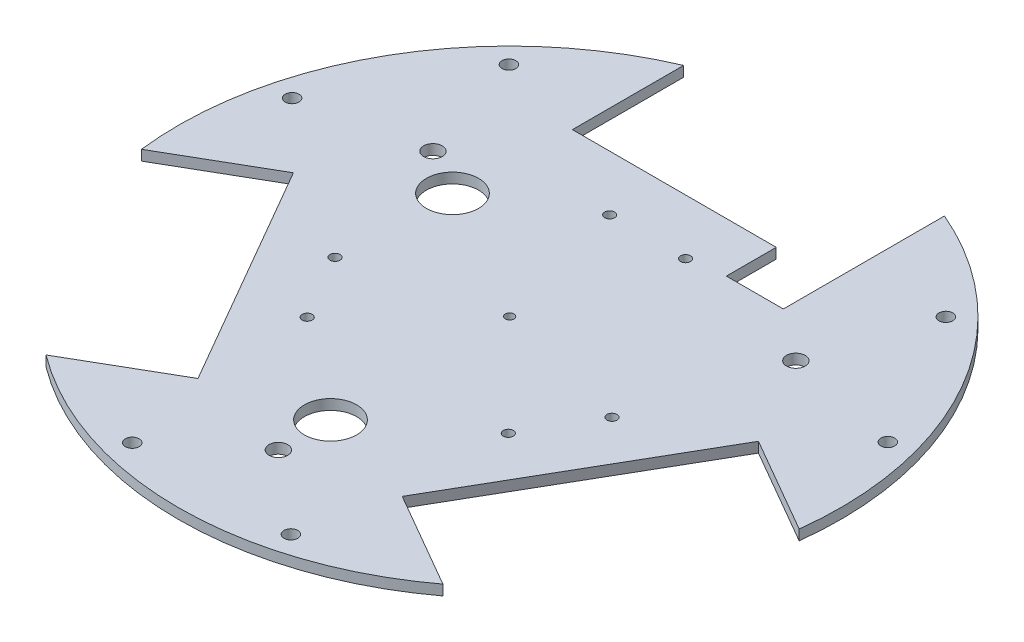
ISO-10303-21;
HEADER;
FILE_DESCRIPTION(('STEP AP214'),'2;1');
FILE_NAME('part.step','',(''),(''),'','','');
FILE_SCHEMA(('AUTOMOTIVE_DESIGN { 1 0 10303 214 1 1 1 1 }'));
ENDSEC;
DATA;
#1=APPLICATION_CONTEXT('core data for automotive mechanical design processes');
#2=APPLICATION_PROTOCOL_DEFINITION('international standard','automotive_design',2000,#1);
#3=PRODUCT_CONTEXT('',#1,'mechanical');
#4=PRODUCT('Part','Part','',(#3));
#5=PRODUCT_RELATED_PRODUCT_CATEGORY('part','',(#4));
#6=PRODUCT_DEFINITION_FORMATION('','',#4);
#7=PRODUCT_DEFINITION_CONTEXT('part definition',#1,'design');
#8=PRODUCT_DEFINITION('design','',#6,#7);
#9=PRODUCT_DEFINITION_SHAPE('','',#8);
#10=(LENGTH_UNIT() NAMED_UNIT(*) SI_UNIT(.MILLI.,.METRE.));
#11=(NAMED_UNIT(*) PLANE_ANGLE_UNIT() SI_UNIT($,.RADIAN.));
#12=(NAMED_UNIT(*) SI_UNIT($,.STERADIAN.) SOLID_ANGLE_UNIT());
#13=UNCERTAINTY_MEASURE_WITH_UNIT(LENGTH_MEASURE(1.E-05),#10,'distance_accuracy_value','');
#14=(GEOMETRIC_REPRESENTATION_CONTEXT(3) GLOBAL_UNCERTAINTY_ASSIGNED_CONTEXT((#13)) GLOBAL_UNIT_ASSIGNED_CONTEXT((#10,
#11,#12)) REPRESENTATION_CONTEXT('',''));
#15=CARTESIAN_POINT('',(0.,0.,0.));
#16=DIRECTION('',(0.,0.,1.));
#17=DIRECTION('',(1.,0.,0.));
#18=AXIS2_PLACEMENT_3D('',#15,#16,#17);
#19=CARTESIAN_POINT('',(0.,2.3622,0.));
#20=DIRECTION('',(0.,1.,0.));
#21=DIRECTION('',(0.,0.,1.));
#22=AXIS2_PLACEMENT_3D('',#19,#20,#21);
#23=PLANE('',#22);
#24=DIRECTION('',(0.,0.,1.));
#25=VECTOR('',#24,1.);
#26=CARTESIAN_POINT('',(29.9999999999978,2.3622,-44.4499999999999));
#27=LINE('',#26,#25);
#28=CARTESIAN_POINT('',(29.999999999998,2.3622,-70.0459848956393));
#29=VERTEX_POINT('',#28);
#30=CARTESIAN_POINT('',(29.9999999999978,2.3622,-32.9726968719721));
#31=VERTEX_POINT('',#30);
#32=EDGE_CURVE('E267',#29,#31,#27,.T.);
#33=ORIENTED_EDGE('',*,*,#32,.T.);
#34=DIRECTION('',(1.,0.,0.));
#35=VECTOR('',#34,1.);
#36=CARTESIAN_POINT('',(29.9999999999978,2.3622,-32.9726968719721));
#37=LINE('',#36,#35);
#38=CARTESIAN_POINT('',(16.8935367171605,2.3622,-32.9726968719721));
#39=VERTEX_POINT('',#38);
#40=EDGE_CURVE('E355',#39,#31,#37,.T.);
#41=ORIENTED_EDGE('',*,*,#40,.F.);
#42=DIRECTION('',(0.,0.,1.));
#43=VECTOR('',#42,1.);
#44=CARTESIAN_POINT('',(16.8935367171605,2.3622,-44.4499999999999));
#45=LINE('',#44,#43);
#46=CARTESIAN_POINT('',(16.8935367171605,2.3622,-44.4499999999999));
#47=VERTEX_POINT('',#46);
#48=EDGE_CURVE('E360',#47,#39,#45,.T.);
#49=ORIENTED_EDGE('',*,*,#48,.F.);
#50=DIRECTION('',(-1.,0.,0.));
#51=VECTOR('',#50,1.);
#52=CARTESIAN_POINT('',(-29.9999999999948,2.3622,-44.45));
#53=LINE('',#52,#51);
#54=CARTESIAN_POINT('',(-29.9999999999948,2.3622,-44.45));
#55=VERTEX_POINT('',#54);
#56=EDGE_CURVE('E248',#47,#55,#53,.T.);
#57=ORIENTED_EDGE('',*,*,#56,.T.);
#58=DIRECTION('',(0.,0.,-1.));
#59=VECTOR('',#58,1.);
#60=CARTESIAN_POINT('',(-29.9999999999948,2.3622,-44.45));
#61=LINE('',#60,#59);
#62=CARTESIAN_POINT('',(-29.9999999999947,2.3622,-70.0459848956406));
#63=VERTEX_POINT('',#62);
#64=EDGE_CURVE('E263',#55,#63,#61,.T.);
#65=ORIENTED_EDGE('',*,*,#64,.T.);
#66=CARTESIAN_POINT('',(0.,2.3622,0.));
#67=DIRECTION('',(0.,1.,0.));
#68=DIRECTION('',(0.,0.,1.));
#69=AXIS2_PLACEMENT_3D('',#66,#67,#68);
#70=CIRCLE('',#69,76.2);
#71=CARTESIAN_POINT('',(-75.6616023527236,2.3622,9.04223033428858));
#72=VERTEX_POINT('',#71);
#73=EDGE_CURVE('E139',#63,#72,#70,.T.);
#74=ORIENTED_EDGE('',*,*,#73,.T.);
#75=DIRECTION('',(0.866025403784438,0.,-0.5));
#76=VECTOR('',#75,1.);
#77=CARTESIAN_POINT('',(-53.4948291982171,2.3622,-3.75576211353112));
#78=LINE('',#77,#76);
#79=CARTESIAN_POINT('',(-53.4948291982171,2.3622,-3.75576211353112));
#80=VERTEX_POINT('',#79);
#81=EDGE_CURVE('E131',#72,#80,#78,.T.);
#82=ORIENTED_EDGE('',*,*,#81,.T.);
#83=DIRECTION('',(0.5,0.,0.866025403784439));
#84=VECTOR('',#83,1.);
#85=CARTESIAN_POINT('',(-23.4948291982209,2.3622,48.2057621135286));
#86=LINE('',#85,#84);
#87=CARTESIAN_POINT('',(-23.4948291982209,2.3622,48.2057621135286));
#88=VERTEX_POINT('',#87);
#89=EDGE_CURVE('E136',#80,#88,#86,.T.);
#90=ORIENTED_EDGE('',*,*,#89,.T.);
#91=DIRECTION('',(-0.866025403784432,0.,0.500000000000011));
#92=VECTOR('',#91,1.);
#93=CARTESIAN_POINT('',(-23.4948291982209,2.3622,48.2057621135286));
#94=LINE('',#93,#92);
#95=CARTESIAN_POINT('',(-45.6616023527282,2.3622,61.0037545613491));
#96=VERTEX_POINT('',#95);
#97=EDGE_CURVE('E56',#88,#96,#94,.T.);
#98=ORIENTED_EDGE('',*,*,#97,.T.);
#99=CARTESIAN_POINT('',(0.,2.3622,0.));
#100=DIRECTION('',(0.,1.,0.));
#101=DIRECTION('',(0.,0.,1.));
#102=AXIS2_PLACEMENT_3D('',#99,#100,#101);
#103=CIRCLE('',#102,76.2);
#104=CARTESIAN_POINT('',(45.6616023527254,2.3622,61.0037545613512));
#105=VERTEX_POINT('',#104);
#106=EDGE_CURVE('E185',#96,#105,#103,.T.);
#107=ORIENTED_EDGE('',*,*,#106,.T.);
#108=DIRECTION('',(-0.866025403784434,0.,-0.500000000000008));
#109=VECTOR('',#108,1.);
#110=CARTESIAN_POINT('',(23.494829198219,2.3622,48.2057621135313));
#111=LINE('',#110,#109);
#112=CARTESIAN_POINT('',(23.494829198219,2.3622,48.2057621135313));
#113=VERTEX_POINT('',#112);
#114=EDGE_CURVE('E107',#105,#113,#111,.T.);
#115=ORIENTED_EDGE('',*,*,#114,.T.);
#116=DIRECTION('',(0.500000000000004,0.,-0.866025403784436));
#117=VECTOR('',#116,1.);
#118=CARTESIAN_POINT('',(53.4948291982157,2.3622,-3.75576211352863));
#119=LINE('',#118,#117);
#120=CARTESIAN_POINT('',(53.4948291982157,2.3622,-3.75576211352863));
#121=VERTEX_POINT('',#120);
#122=EDGE_CURVE('E273',#113,#121,#119,.T.);
#123=ORIENTED_EDGE('',*,*,#122,.T.);
#124=DIRECTION('',(0.866025403784432,0.,0.500000000000011));
#125=VECTOR('',#124,1.);
#126=CARTESIAN_POINT('',(53.4948291982157,2.3622,-3.75576211352863));
#127=LINE('',#126,#125);
#128=CARTESIAN_POINT('',(75.6616023527232,2.3622,9.04223033429203));
#129=VERTEX_POINT('',#128);
#130=EDGE_CURVE('E271',#121,#129,#127,.T.);
#131=ORIENTED_EDGE('',*,*,#130,.T.);
#132=CARTESIAN_POINT('',(0.,2.3622,0.));
#133=DIRECTION('',(0.,1.,0.));
#134=DIRECTION('',(0.,0.,1.));
#135=AXIS2_PLACEMENT_3D('',#132,#133,#134);
#136=CIRCLE('',#135,76.2);
#137=EDGE_CURVE('E269',#129,#29,#136,.T.);
#138=ORIENTED_EDGE('',*,*,#137,.T.);
#139=EDGE_LOOP('',(#33,#41,#49,#57,#65,#74,#82,#90,#98,#107,#115,#123,#131,#138));
#140=FACE_BOUND('',#139,.T.);
#141=CARTESIAN_POINT('',(-23.1306815701561,2.3622,23.4364843067927));
#142=DIRECTION('',(0.,1.,0.));
#143=DIRECTION('',(0.,0.,1.));
#144=AXIS2_PLACEMENT_3D('',#141,#142,#143);
#145=CIRCLE('',#144,1.14935);
#146=CARTESIAN_POINT('',(-23.1306815701561,2.3622,24.5858343067927));
#147=VERTEX_POINT('',#146);
#148=EDGE_CURVE('E344',#147,#147,#145,.T.);
#149=ORIENTED_EDGE('',*,*,#148,.F.);
#150=EDGE_LOOP('',(#149));
#151=FACE_BOUND('',#150,.T.);
#152=CARTESIAN_POINT('',(-31.8619315701551,2.3622,8.31351569320629));
#153=DIRECTION('',(0.,1.,0.));
#154=DIRECTION('',(0.,0.,1.));
#155=AXIS2_PLACEMENT_3D('',#152,#153,#154);
#156=CIRCLE('',#155,1.14935);
#157=CARTESIAN_POINT('',(-31.8619315701551,2.3622,9.46286569320629));
#158=VERTEX_POINT('',#157);
#159=EDGE_CURVE('E338',#158,#158,#156,.T.);
#160=ORIENTED_EDGE('',*,*,#159,.F.);
#161=EDGE_LOOP('',(#160));
#162=FACE_BOUND('',#161,.T.);
#163=CARTESIAN_POINT('',(31.8619315701559,2.3622,8.31351569320727));
#164=DIRECTION('',(0.,1.,0.));
#165=DIRECTION('',(0.,0.,1.));
#166=AXIS2_PLACEMENT_3D('',#163,#164,#165);
#167=CIRCLE('',#166,1.14935);
#168=CARTESIAN_POINT('',(31.8619315701559,2.3622,9.46286569320727));
#169=VERTEX_POINT('',#168);
#170=EDGE_CURVE('E332',#169,#169,#167,.T.);
#171=ORIENTED_EDGE('',*,*,#170,.F.);
#172=EDGE_LOOP('',(#171));
#173=FACE_BOUND('',#172,.T.);
#174=CARTESIAN_POINT('',(23.1306815701549,2.3622,23.4364843067925));
#175=DIRECTION('',(0.,1.,0.));
#176=DIRECTION('',(0.,0.,1.));
#177=AXIS2_PLACEMENT_3D('',#174,#175,#176);
#178=CIRCLE('',#177,1.14935);
#179=CARTESIAN_POINT('',(23.1306815701549,2.3622,24.5858343067925));
#180=VERTEX_POINT('',#179);
#181=EDGE_CURVE('E326',#180,#180,#178,.T.);
#182=ORIENTED_EDGE('',*,*,#181,.F.);
#183=EDGE_LOOP('',(#182));
#184=FACE_BOUND('',#183,.T.);
#185=CARTESIAN_POINT('',(-8.73125,2.3622,-31.75));
#186=DIRECTION('',(0.,1.,0.));
#187=DIRECTION('',(0.,0.,1.));
#188=AXIS2_PLACEMENT_3D('',#185,#186,#187);
#189=CIRCLE('',#188,1.14935);
#190=CARTESIAN_POINT('',(-8.73125,2.3622,-30.60065));
#191=VERTEX_POINT('',#190);
#192=EDGE_CURVE('E320',#191,#191,#189,.T.);
#193=ORIENTED_EDGE('',*,*,#192,.F.);
#194=EDGE_LOOP('',(#193));
#195=FACE_BOUND('',#194,.T.);
#196=CARTESIAN_POINT('',(8.73125,2.3622,-31.7499999999989));
#197=DIRECTION('',(0.,1.,0.));
#198=DIRECTION('',(0.,0.,1.));
#199=AXIS2_PLACEMENT_3D('',#196,#197,#198);
#200=CIRCLE('',#199,1.14935);
#201=CARTESIAN_POINT('',(8.73125,2.3622,-30.6006499999989));
#202=VERTEX_POINT('',#201);
#203=EDGE_CURVE('E314',#202,#202,#200,.T.);
#204=ORIENTED_EDGE('',*,*,#203,.F.);
#205=EDGE_LOOP('',(#204));
#206=FACE_BOUND('',#205,.T.);
#207=CARTESIAN_POINT('',(68.520147191537,2.3622,-18.4796237221597));
#208=DIRECTION('',(0.,1.,0.));
#209=DIRECTION('',(0.866025403784443,0.,-0.499999999999992));
#210=AXIS2_PLACEMENT_3D('',#207,#208,#209);
#211=CIRCLE('',#210,1.5875);
#212=CARTESIAN_POINT('',(69.8949625200448,2.3622,-19.2733737221597));
#213=VERTEX_POINT('',#212);
#214=EDGE_CURVE('E241',#213,#213,#211,.T.);
#215=ORIENTED_EDGE('',*,*,#214,.F.);
#216=EDGE_LOOP('',(#215));
#217=FACE_BOUND('',#216,.T.);
#218=CARTESIAN_POINT('',(50.2638971915373,2.3622,-50.1003762778392));
#219=DIRECTION('',(0.,1.,0.));
#220=DIRECTION('',(0.866025403784443,0.,-0.499999999999992));
#221=AXIS2_PLACEMENT_3D('',#218,#219,#220);
#222=CIRCLE('',#221,1.5875);
#223=CARTESIAN_POINT('',(51.6387125200451,2.3622,-50.8941262778392));
#224=VERTEX_POINT('',#223);
#225=EDGE_CURVE('E238',#224,#224,#222,.T.);
#226=ORIENTED_EDGE('',*,*,#225,.F.);
#227=EDGE_LOOP('',(#226));
#228=FACE_BOUND('',#227,.T.);
#229=CARTESIAN_POINT('',(-50.2638971915366,2.3622,-50.1003762778399));
#230=DIRECTION('',(0.,1.,0.));
#231=DIRECTION('',(-0.866025403784436,0.,-0.500000000000004));
#232=AXIS2_PLACEMENT_3D('',#229,#230,#231);
#233=CIRCLE('',#232,1.5875);
#234=CARTESIAN_POINT('',(-51.6387125200444,2.3622,-50.8941262778399));
#235=VERTEX_POINT('',#234);
#236=EDGE_CURVE('E234',#235,#235,#233,.T.);
#237=ORIENTED_EDGE('',*,*,#236,.F.);
#238=EDGE_LOOP('',(#237));
#239=FACE_BOUND('',#238,.T.);
#240=CARTESIAN_POINT('',(-68.5201471915367,2.3622,-18.4796237221607));
#241=DIRECTION('',(0.,1.,0.));
#242=DIRECTION('',(-0.866025403784436,0.,-0.500000000000004));
#243=AXIS2_PLACEMENT_3D('',#240,#241,#242);
#244=CIRCLE('',#243,1.5875);
#245=CARTESIAN_POINT('',(-69.8949625200445,2.3622,-19.2733737221607));
#246=VERTEX_POINT('',#245);
#247=EDGE_CURVE('E230',#246,#246,#244,.T.);
#248=ORIENTED_EDGE('',*,*,#247,.F.);
#249=EDGE_LOOP('',(#248));
#250=FACE_BOUND('',#249,.T.);
#251=CARTESIAN_POINT('',(0.,2.3622,0.));
#252=DIRECTION('',(0.,1.,0.));
#253=DIRECTION('',(0.,0.,1.));
#254=AXIS2_PLACEMENT_3D('',#251,#252,#253);
#255=CIRCLE('',#254,1.);
#256=CARTESIAN_POINT('',(0.,2.3622,1.));
#257=VERTEX_POINT('',#256);
#258=EDGE_CURVE('E301',#257,#257,#255,.T.);
#259=ORIENTED_EDGE('',*,*,#258,.F.);
#260=EDGE_LOOP('',(#259));
#261=FACE_BOUND('',#260,.T.);
#262=CARTESIAN_POINT('',(0.,2.3622,41.2057621135311));
#263=DIRECTION('',(0.,1.,0.));
#264=DIRECTION('',(0.,0.,1.));
#265=AXIS2_PLACEMENT_3D('',#262,#263,#264);
#266=CIRCLE('',#265,6.);
#267=CARTESIAN_POINT('',(0.,2.3622,47.2057621135311));
#268=VERTEX_POINT('',#267);
#269=EDGE_CURVE('E225',#268,#268,#266,.T.);
#270=ORIENTED_EDGE('',*,*,#269,.F.);
#271=EDGE_LOOP('',(#270));
#272=FACE_BOUND('',#271,.T.);
#273=CARTESIAN_POINT('',(-31.0953378678307,2.3622,-17.9529016885348));
#274=DIRECTION('',(0.,1.,0.));
#275=DIRECTION('',(0.,0.,1.));
#276=AXIS2_PLACEMENT_3D('',#273,#274,#275);
#277=CIRCLE('',#276,5.999999938);
#278=CARTESIAN_POINT('',(-31.0953378678307,2.3622,-11.9529017505348));
#279=VERTEX_POINT('',#278);
#280=EDGE_CURVE('E221',#279,#279,#277,.T.);
#281=ORIENTED_EDGE('',*,*,#280,.F.);
#282=EDGE_LOOP('',(#281));
#283=FACE_BOUND('',#282,.T.);
#284=CARTESIAN_POINT('',(-18.25625,2.3622,68.58));
#285=DIRECTION('',(0.,1.,0.));
#286=DIRECTION('',(0.,0.,1.));
#287=AXIS2_PLACEMENT_3D('',#284,#285,#286);
#288=CIRCLE('',#287,1.5875);
#289=CARTESIAN_POINT('',(-18.25625,2.3622,70.1675));
#290=VERTEX_POINT('',#289);
#291=EDGE_CURVE('E217',#290,#290,#288,.T.);
#292=ORIENTED_EDGE('',*,*,#291,.F.);
#293=EDGE_LOOP('',(#292));
#294=FACE_BOUND('',#293,.T.);
#295=CARTESIAN_POINT('',(18.25625,2.3622,68.58));
#296=DIRECTION('',(0.,1.,0.));
#297=DIRECTION('',(0.,0.,1.));
#298=AXIS2_PLACEMENT_3D('',#295,#296,#297);
#299=CIRCLE('',#298,1.5875);
#300=CARTESIAN_POINT('',(18.25625,2.3622,70.1675));
#301=VERTEX_POINT('',#300);
#302=EDGE_CURVE('E213',#301,#301,#299,.T.);
#303=ORIENTED_EDGE('',*,*,#302,.F.);
#304=EDGE_LOOP('',(#303));
#305=FACE_BOUND('',#304,.T.);
#306=CARTESIAN_POINT('',(41.747414599111,2.3622,-24.1028810567663));
#307=DIRECTION('',(0.,1.,0.));
#308=DIRECTION('',(0.,0.,1.));
#309=AXIS2_PLACEMENT_3D('',#306,#307,#308);
#310=CIRCLE('',#309,2.14630000000001);
#311=CARTESIAN_POINT('',(41.747414599111,2.3622,-21.9565810567663));
#312=VERTEX_POINT('',#311);
#313=EDGE_CURVE('E280',#312,#312,#310,.T.);
#314=ORIENTED_EDGE('',*,*,#313,.F.);
#315=EDGE_LOOP('',(#314));
#316=FACE_BOUND('',#315,.T.);
#317=CARTESIAN_POINT('',(-41.7474145991068,2.3622,-24.1028810567702));
#318=DIRECTION('',(0.,1.,0.));
#319=DIRECTION('',(0.,0.,1.));
#320=AXIS2_PLACEMENT_3D('',#317,#318,#319);
#321=CIRCLE('',#320,2.1463);
#322=CARTESIAN_POINT('',(-41.7474145991068,2.3622,-21.9565810567702));
#323=VERTEX_POINT('',#322);
#324=EDGE_CURVE('E164',#323,#323,#321,.T.);
#325=ORIENTED_EDGE('',*,*,#324,.F.);
#326=EDGE_LOOP('',(#325));
#327=FACE_BOUND('',#326,.T.);
#328=CARTESIAN_POINT('',(0.,2.3622,53.2057621135311));
#329=DIRECTION('',(0.,1.,0.));
#330=DIRECTION('',(0.,0.,-1.));
#331=AXIS2_PLACEMENT_3D('',#328,#329,#330);
#332=CIRCLE('',#331,2.1463);
#333=CARTESIAN_POINT('',(0.,2.3622,51.0594621135311));
#334=VERTEX_POINT('',#333);
#335=EDGE_CURVE('E286',#334,#334,#332,.T.);
#336=ORIENTED_EDGE('',*,*,#335,.F.);
#337=EDGE_LOOP('',(#336));
#338=FACE_BOUND('',#337,.T.);
#339=ADVANCED_FACE('F32',(#140,#151,#162,#173,#184,#195,#206,#217,#228,#239,#250,#261,#272,#283,
#294,#305,#316,#327,#338),#23,.T.);
#340=CARTESIAN_POINT('',(0.,0.,0.));
#341=DIRECTION('',(0.,1.,0.));
#342=DIRECTION('',(0.,0.,1.));
#343=AXIS2_PLACEMENT_3D('',#340,#341,#342);
#344=PLANE('',#343);
#345=CARTESIAN_POINT('',(-23.1306815701561,0.,23.4364843067927));
#346=DIRECTION('',(0.,-1.,0.));
#347=DIRECTION('',(-0.866025403784443,0.,0.499999999999992));
#348=AXIS2_PLACEMENT_3D('',#345,#346,#347);
#349=CIRCLE('',#348,1.14935);
#350=CARTESIAN_POINT('',(-24.1260478679958,0.,24.0111593067926));
#351=VERTEX_POINT('',#350);
#352=EDGE_CURVE('E347',#351,#351,#349,.T.);
#353=ORIENTED_EDGE('',*,*,#352,.F.);
#354=EDGE_LOOP('',(#353));
#355=FACE_BOUND('',#354,.T.);
#356=CARTESIAN_POINT('',(-31.8619315701551,0.,8.31351569320629));
#357=DIRECTION('',(0.,-1.,0.));
#358=DIRECTION('',(-0.866025403784443,0.,0.499999999999992));
#359=AXIS2_PLACEMENT_3D('',#356,#357,#358);
#360=CIRCLE('',#359,1.14935);
#361=CARTESIAN_POINT('',(-32.8572978679947,0.,8.88819069320628));
#362=VERTEX_POINT('',#361);
#363=EDGE_CURVE('E341',#362,#362,#360,.T.);
#364=ORIENTED_EDGE('',*,*,#363,.F.);
#365=EDGE_LOOP('',(#364));
#366=FACE_BOUND('',#365,.T.);
#367=CARTESIAN_POINT('',(31.8619315701559,0.,8.31351569320727));
#368=DIRECTION('',(0.,-1.,0.));
#369=DIRECTION('',(0.866025403784436,0.,0.500000000000004));
#370=AXIS2_PLACEMENT_3D('',#367,#368,#369);
#371=CIRCLE('',#370,1.14935);
#372=CARTESIAN_POINT('',(32.8572978679955,0.,8.88819069320728));
#373=VERTEX_POINT('',#372);
#374=EDGE_CURVE('E335',#373,#373,#371,.T.);
#375=ORIENTED_EDGE('',*,*,#374,.F.);
#376=EDGE_LOOP('',(#375));
#377=FACE_BOUND('',#376,.T.);
#378=CARTESIAN_POINT('',(23.1306815701549,0.,23.4364843067925));
#379=DIRECTION('',(0.,-1.,0.));
#380=DIRECTION('',(0.866025403784436,0.,0.500000000000004));
#381=AXIS2_PLACEMENT_3D('',#378,#379,#380);
#382=CIRCLE('',#381,1.14935);
#383=CARTESIAN_POINT('',(24.1260478679945,0.,24.0111593067925));
#384=VERTEX_POINT('',#383);
#385=EDGE_CURVE('E329',#384,#384,#382,.T.);
#386=ORIENTED_EDGE('',*,*,#385,.F.);
#387=EDGE_LOOP('',(#386));
#388=FACE_BOUND('',#387,.T.);
#389=CARTESIAN_POINT('',(-8.73125,0.,-31.75));
#390=DIRECTION('',(0.,-1.,0.));
#391=DIRECTION('',(0.,0.,-1.));
#392=AXIS2_PLACEMENT_3D('',#389,#390,#391);
#393=CIRCLE('',#392,1.14935);
#394=CARTESIAN_POINT('',(-8.73125,0.,-32.89935));
#395=VERTEX_POINT('',#394);
#396=EDGE_CURVE('E323',#395,#395,#393,.T.);
#397=ORIENTED_EDGE('',*,*,#396,.F.);
#398=EDGE_LOOP('',(#397));
#399=FACE_BOUND('',#398,.T.);
#400=CARTESIAN_POINT('',(8.73125,0.,-31.7499999999989));
#401=DIRECTION('',(0.,-1.,0.));
#402=DIRECTION('',(0.,0.,-1.));
#403=AXIS2_PLACEMENT_3D('',#400,#401,#402);
#404=CIRCLE('',#403,1.14935);
#405=CARTESIAN_POINT('',(8.73125,0.,-32.8993499999989));
#406=VERTEX_POINT('',#405);
#407=EDGE_CURVE('E317',#406,#406,#404,.T.);
#408=ORIENTED_EDGE('',*,*,#407,.F.);
#409=EDGE_LOOP('',(#408));
#410=FACE_BOUND('',#409,.T.);
#411=CARTESIAN_POINT('',(68.520147191537,0.,-18.4796237221597));
#412=DIRECTION('',(0.,1.,0.));
#413=DIRECTION('',(0.,0.,1.));
#414=AXIS2_PLACEMENT_3D('',#411,#412,#413);
#415=CIRCLE('',#414,1.5875);
#416=CARTESIAN_POINT('',(68.520147191537,0.,-16.8921237221597));
#417=VERTEX_POINT('',#416);
#418=EDGE_CURVE('E239',#417,#417,#415,.T.);
#419=ORIENTED_EDGE('',*,*,#418,.T.);
#420=EDGE_LOOP('',(#419));
#421=FACE_BOUND('',#420,.T.);
#422=CARTESIAN_POINT('',(50.2638971915373,0.,-50.1003762778392));
#423=DIRECTION('',(0.,1.,0.));
#424=DIRECTION('',(0.,0.,1.));
#425=AXIS2_PLACEMENT_3D('',#422,#423,#424);
#426=CIRCLE('',#425,1.5875);
#427=CARTESIAN_POINT('',(50.2638971915373,0.,-48.5128762778392));
#428=VERTEX_POINT('',#427);
#429=EDGE_CURVE('E235',#428,#428,#426,.T.);
#430=ORIENTED_EDGE('',*,*,#429,.T.);
#431=EDGE_LOOP('',(#430));
#432=FACE_BOUND('',#431,.T.);
#433=CARTESIAN_POINT('',(-50.2638971915366,0.,-50.1003762778399));
#434=DIRECTION('',(0.,1.,0.));
#435=DIRECTION('',(0.,0.,1.));
#436=AXIS2_PLACEMENT_3D('',#433,#434,#435);
#437=CIRCLE('',#436,1.5875);
#438=CARTESIAN_POINT('',(-50.2638971915366,0.,-48.5128762778399));
#439=VERTEX_POINT('',#438);
#440=EDGE_CURVE('E231',#439,#439,#437,.T.);
#441=ORIENTED_EDGE('',*,*,#440,.T.);
#442=EDGE_LOOP('',(#441));
#443=FACE_BOUND('',#442,.T.);
#444=CARTESIAN_POINT('',(-68.5201471915367,0.,-18.4796237221607));
#445=DIRECTION('',(0.,1.,0.));
#446=DIRECTION('',(0.,0.,1.));
#447=AXIS2_PLACEMENT_3D('',#444,#445,#446);
#448=CIRCLE('',#447,1.5875);
#449=CARTESIAN_POINT('',(-68.5201471915367,0.,-16.8921237221607));
#450=VERTEX_POINT('',#449);
#451=EDGE_CURVE('E226',#450,#450,#448,.T.);
#452=ORIENTED_EDGE('',*,*,#451,.T.);
#453=EDGE_LOOP('',(#452));
#454=FACE_BOUND('',#453,.T.);
#455=CARTESIAN_POINT('',(0.,0.,0.));
#456=DIRECTION('',(0.,-1.,0.));
#457=DIRECTION('',(0.,0.,-1.));
#458=AXIS2_PLACEMENT_3D('',#455,#456,#457);
#459=CIRCLE('',#458,1.);
#460=CARTESIAN_POINT('',(0.,0.,-1.));
#461=VERTEX_POINT('',#460);
#462=EDGE_CURVE('E229',#461,#461,#459,.T.);
#463=ORIENTED_EDGE('',*,*,#462,.F.);
#464=EDGE_LOOP('',(#463));
#465=FACE_BOUND('',#464,.T.);
#466=CARTESIAN_POINT('',(0.,0.,41.2057621135311));
#467=DIRECTION('',(0.,1.,0.));
#468=DIRECTION('',(0.,0.,1.));
#469=AXIS2_PLACEMENT_3D('',#466,#467,#468);
#470=CIRCLE('',#469,6.);
#471=CARTESIAN_POINT('',(0.,0.,47.2057621135311));
#472=VERTEX_POINT('',#471);
#473=EDGE_CURVE('E222',#472,#472,#470,.T.);
#474=ORIENTED_EDGE('',*,*,#473,.T.);
#475=EDGE_LOOP('',(#474));
#476=FACE_BOUND('',#475,.T.);
#477=CARTESIAN_POINT('',(-31.0953378678307,0.,-17.9529016885348));
#478=DIRECTION('',(0.,1.,0.));
#479=DIRECTION('',(0.,0.,1.));
#480=AXIS2_PLACEMENT_3D('',#477,#478,#479);
#481=CIRCLE('',#480,5.999999938);
#482=CARTESIAN_POINT('',(-31.0953378678307,0.,-11.9529017505348));
#483=VERTEX_POINT('',#482);
#484=EDGE_CURVE('E218',#483,#483,#481,.T.);
#485=ORIENTED_EDGE('',*,*,#484,.T.);
#486=EDGE_LOOP('',(#485));
#487=FACE_BOUND('',#486,.T.);
#488=CARTESIAN_POINT('',(-18.25625,0.,68.58));
#489=DIRECTION('',(0.,1.,0.));
#490=DIRECTION('',(0.,0.,1.));
#491=AXIS2_PLACEMENT_3D('',#488,#489,#490);
#492=CIRCLE('',#491,1.5875);
#493=CARTESIAN_POINT('',(-18.25625,0.,70.1675));
#494=VERTEX_POINT('',#493);
#495=EDGE_CURVE('E214',#494,#494,#492,.T.);
#496=ORIENTED_EDGE('',*,*,#495,.T.);
#497=EDGE_LOOP('',(#496));
#498=FACE_BOUND('',#497,.T.);
#499=CARTESIAN_POINT('',(18.25625,0.,68.58));
#500=DIRECTION('',(0.,1.,0.));
#501=DIRECTION('',(0.,0.,1.));
#502=AXIS2_PLACEMENT_3D('',#499,#500,#501);
#503=CIRCLE('',#502,1.5875);
#504=CARTESIAN_POINT('',(18.25625,0.,70.1675));
#505=VERTEX_POINT('',#504);
#506=EDGE_CURVE('E209',#505,#505,#503,.T.);
#507=ORIENTED_EDGE('',*,*,#506,.T.);
#508=EDGE_LOOP('',(#507));
#509=FACE_BOUND('',#508,.T.);
#510=CARTESIAN_POINT('',(41.747414599111,0.,-24.1028810567663));
#511=DIRECTION('',(0.,1.,0.));
#512=DIRECTION('',(0.,0.,1.));
#513=AXIS2_PLACEMENT_3D('',#510,#511,#512);
#514=CIRCLE('',#513,2.14630000000001);
#515=CARTESIAN_POINT('',(41.747414599111,0.,-21.9565810567663));
#516=VERTEX_POINT('',#515);
#517=EDGE_CURVE('E283',#516,#516,#514,.T.);
#518=ORIENTED_EDGE('',*,*,#517,.T.);
#519=EDGE_LOOP('',(#518));
#520=FACE_BOUND('',#519,.T.);
#521=DIRECTION('',(1.,0.,0.));
#522=VECTOR('',#521,1.);
#523=CARTESIAN_POINT('',(0.,0.,-32.9726968719721));
#524=LINE('',#523,#522);
#525=CARTESIAN_POINT('',(16.8935367171605,0.,-32.9726968719721));
#526=VERTEX_POINT('',#525);
#527=CARTESIAN_POINT('',(29.9999999999978,0.,-32.9726968719721));
#528=VERTEX_POINT('',#527);
#529=EDGE_CURVE('E11',#526,#528,#524,.T.);
#530=ORIENTED_EDGE('',*,*,#529,.T.);
#531=DIRECTION('',(0.,0.,1.));
#532=VECTOR('',#531,1.);
#533=CARTESIAN_POINT('',(29.9999999999978,0.,-44.4499999999999));
#534=LINE('',#533,#532);
#535=CARTESIAN_POINT('',(29.999999999998,0.,-70.0459848956393));
#536=VERTEX_POINT('',#535);
#537=EDGE_CURVE('E172',#536,#528,#534,.T.);
#538=ORIENTED_EDGE('',*,*,#537,.F.);
#539=CARTESIAN_POINT('',(0.,0.,0.));
#540=DIRECTION('',(0.,1.,0.));
#541=DIRECTION('',(0.,0.,1.));
#542=AXIS2_PLACEMENT_3D('',#539,#540,#541);
#543=CIRCLE('',#542,76.2);
#544=CARTESIAN_POINT('',(75.6616023527232,0.,9.04223033429203));
#545=VERTEX_POINT('',#544);
#546=EDGE_CURVE('E170',#545,#536,#543,.T.);
#547=ORIENTED_EDGE('',*,*,#546,.F.);
#548=DIRECTION('',(0.866025403784432,0.,0.500000000000011));
#549=VECTOR('',#548,1.);
#550=CARTESIAN_POINT('',(53.4948291982157,0.,-3.75576211352863));
#551=LINE('',#550,#549);
#552=CARTESIAN_POINT('',(53.4948291982157,0.,-3.75576211352863));
#553=VERTEX_POINT('',#552);
#554=EDGE_CURVE('E168',#553,#545,#551,.T.);
#555=ORIENTED_EDGE('',*,*,#554,.F.);
#556=DIRECTION('',(0.500000000000004,0.,-0.866025403784436));
#557=VECTOR('',#556,1.);
#558=CARTESIAN_POINT('',(53.4948291982157,0.,-3.75576211352863));
#559=LINE('',#558,#557);
#560=CARTESIAN_POINT('',(23.494829198219,0.,48.2057621135313));
#561=VERTEX_POINT('',#560);
#562=EDGE_CURVE('E166',#561,#553,#559,.T.);
#563=ORIENTED_EDGE('',*,*,#562,.F.);
#564=DIRECTION('',(-0.866025403784434,0.,-0.500000000000008));
#565=VECTOR('',#564,1.);
#566=CARTESIAN_POINT('',(23.494829198219,0.,48.2057621135313));
#567=LINE('',#566,#565);
#568=CARTESIAN_POINT('',(45.6616023527254,0.,61.0037545613512));
#569=VERTEX_POINT('',#568);
#570=EDGE_CURVE('E163',#569,#561,#567,.T.);
#571=ORIENTED_EDGE('',*,*,#570,.F.);
#572=CARTESIAN_POINT('',(0.,0.,0.));
#573=DIRECTION('',(0.,1.,0.));
#574=DIRECTION('',(0.,0.,1.));
#575=AXIS2_PLACEMENT_3D('',#572,#573,#574);
#576=CIRCLE('',#575,76.2);
#577=CARTESIAN_POINT('',(-45.6616023527282,0.,61.0037545613491));
#578=VERTEX_POINT('',#577);
#579=EDGE_CURVE('E160',#578,#569,#576,.T.);
#580=ORIENTED_EDGE('',*,*,#579,.F.);
#581=DIRECTION('',(-0.866025403784432,0.,0.500000000000011));
#582=VECTOR('',#581,1.);
#583=CARTESIAN_POINT('',(-23.4948291982209,0.,48.2057621135286));
#584=LINE('',#583,#582);
#585=CARTESIAN_POINT('',(-23.4948291982209,0.,48.2057621135286));
#586=VERTEX_POINT('',#585);
#587=EDGE_CURVE('E98',#586,#578,#584,.T.);
#588=ORIENTED_EDGE('',*,*,#587,.F.);
#589=DIRECTION('',(0.5,0.,0.866025403784439));
#590=VECTOR('',#589,1.);
#591=CARTESIAN_POINT('',(-23.4948291982209,0.,48.2057621135286));
#592=LINE('',#591,#590);
#593=CARTESIAN_POINT('',(-53.4948291982171,0.,-3.75576211353112));
#594=VERTEX_POINT('',#593);
#595=EDGE_CURVE('E182',#594,#586,#592,.T.);
#596=ORIENTED_EDGE('',*,*,#595,.F.);
#597=DIRECTION('',(0.866025403784438,0.,-0.5));
#598=VECTOR('',#597,1.);
#599=CARTESIAN_POINT('',(-53.4948291982171,0.,-3.75576211353112));
#600=LINE('',#599,#598);
#601=CARTESIAN_POINT('',(-75.6616023527236,0.,9.04223033428858));
#602=VERTEX_POINT('',#601);
#603=EDGE_CURVE('E148',#602,#594,#600,.T.);
#604=ORIENTED_EDGE('',*,*,#603,.F.);
#605=CARTESIAN_POINT('',(0.,0.,0.));
#606=DIRECTION('',(0.,1.,0.));
#607=DIRECTION('',(0.,0.,1.));
#608=AXIS2_PLACEMENT_3D('',#605,#606,#607);
#609=CIRCLE('',#608,76.2);
#610=CARTESIAN_POINT('',(-29.9999999999947,0.,-70.0459848956406));
#611=VERTEX_POINT('',#610);
#612=EDGE_CURVE('E179',#611,#602,#609,.T.);
#613=ORIENTED_EDGE('',*,*,#612,.F.);
#614=DIRECTION('',(0.,0.,-1.));
#615=VECTOR('',#614,1.);
#616=CARTESIAN_POINT('',(-29.9999999999948,0.,-44.45));
#617=LINE('',#616,#615);
#618=CARTESIAN_POINT('',(-29.9999999999948,0.,-44.45));
#619=VERTEX_POINT('',#618);
#620=EDGE_CURVE('E177',#619,#611,#617,.T.);
#621=ORIENTED_EDGE('',*,*,#620,.F.);
#622=DIRECTION('',(-1.,0.,0.));
#623=VECTOR('',#622,1.);
#624=CARTESIAN_POINT('',(-29.9999999999948,0.,-44.45));
#625=LINE('',#624,#623);
#626=CARTESIAN_POINT('',(16.8935367171605,0.,-44.4499999999999));
#627=VERTEX_POINT('',#626);
#628=EDGE_CURVE('E175',#627,#619,#625,.T.);
#629=ORIENTED_EDGE('',*,*,#628,.F.);
#630=DIRECTION('',(0.,0.,1.));
#631=VECTOR('',#630,1.);
#632=CARTESIAN_POINT('',(16.8935367171605,0.,0.));
#633=LINE('',#632,#631);
#634=EDGE_CURVE('E47',#627,#526,#633,.T.);
#635=ORIENTED_EDGE('',*,*,#634,.T.);
#636=EDGE_LOOP('',(#530,#538,#547,#555,#563,#571,#580,#588,#596,#604,#613,#621,#629,#635));
#637=FACE_BOUND('',#636,.T.);
#638=CARTESIAN_POINT('',(-41.7474145991068,0.,-24.1028810567702));
#639=DIRECTION('',(0.,1.,0.));
#640=DIRECTION('',(0.,0.,1.));
#641=AXIS2_PLACEMENT_3D('',#638,#639,#640);
#642=CIRCLE('',#641,2.1463);
#643=CARTESIAN_POINT('',(-41.7474145991068,0.,-21.9565810567702));
#644=VERTEX_POINT('',#643);
#645=EDGE_CURVE('E277',#644,#644,#642,.T.);
#646=ORIENTED_EDGE('',*,*,#645,.T.);
#647=EDGE_LOOP('',(#646));
#648=FACE_BOUND('',#647,.T.);
#649=CARTESIAN_POINT('',(0.,0.,53.2057621135311));
#650=DIRECTION('',(0.,1.,0.));
#651=DIRECTION('',(0.,0.,-1.));
#652=AXIS2_PLACEMENT_3D('',#649,#650,#651);
#653=CIRCLE('',#652,2.1463);
#654=CARTESIAN_POINT('',(0.,0.,51.0594621135311));
#655=VERTEX_POINT('',#654);
#656=EDGE_CURVE('E212',#655,#655,#653,.T.);
#657=ORIENTED_EDGE('',*,*,#656,.T.);
#658=EDGE_LOOP('',(#657));
#659=FACE_BOUND('',#658,.T.);
#660=ADVANCED_FACE('F253',(#355,#366,#377,#388,#399,#410,#421,#432,#443,#454,#465,#476,#487,
#498,#509,#520,#637,#648,#659),#344,.F.);
#661=CARTESIAN_POINT('',(0.,2.3622,0.));
#662=DIRECTION('',(0.,-1.,0.));
#663=DIRECTION('',(0.,0.,-1.));
#664=AXIS2_PLACEMENT_3D('',#661,#662,#663);
#665=CYLINDRICAL_SURFACE('',#664,76.2);
#666=ORIENTED_EDGE('',*,*,#579,.T.);
#667=DIRECTION('',(0.,-1.,0.));
#668=VECTOR('',#667,1.);
#669=CARTESIAN_POINT('',(45.6616023527254,2.3622,61.0037545613512));
#670=LINE('',#669,#668);
#671=EDGE_CURVE('E207',#105,#569,#670,.T.);
#672=ORIENTED_EDGE('',*,*,#671,.F.);
#673=ORIENTED_EDGE('',*,*,#106,.F.);
#674=DIRECTION('',(0.,-1.,0.));
#675=VECTOR('',#674,1.);
#676=CARTESIAN_POINT('',(-45.6616023527282,2.3622,61.0037545613491));
#677=LINE('',#676,#675);
#678=EDGE_CURVE('E156',#96,#578,#677,.T.);
#679=ORIENTED_EDGE('',*,*,#678,.T.);
#680=EDGE_LOOP('',(#666,#672,#673,#679));
#681=FACE_BOUND('',#680,.T.);
#682=ADVANCED_FACE('F34',(#681),#665,.T.);
#683=CARTESIAN_POINT('',(23.494829198219,2.3622,48.2057621135313));
#684=DIRECTION('',(-0.500000000000008,0.,0.866025403784434));
#685=DIRECTION('',(0.866025403784434,0.,0.500000000000008));
#686=AXIS2_PLACEMENT_3D('',#683,#684,#685);
#687=PLANE('',#686);
#688=ORIENTED_EDGE('',*,*,#570,.T.);
#689=DIRECTION('',(0.,-1.,0.));
#690=VECTOR('',#689,1.);
#691=CARTESIAN_POINT('',(23.494829198219,2.3622,48.2057621135313));
#692=LINE('',#691,#690);
#693=EDGE_CURVE('E204',#113,#561,#692,.T.);
#694=ORIENTED_EDGE('',*,*,#693,.F.);
#695=ORIENTED_EDGE('',*,*,#114,.F.);
#696=ORIENTED_EDGE('',*,*,#671,.T.);
#697=EDGE_LOOP('',(#688,#694,#695,#696));
#698=FACE_BOUND('',#697,.T.);
#699=ADVANCED_FACE('F393',(#698),#687,.F.);
#700=CARTESIAN_POINT('',(53.4948291982157,2.3622,-3.75576211352863));
#701=DIRECTION('',(-0.866025403784436,0.,-0.500000000000004));
#702=DIRECTION('',(-0.500000000000004,0.,0.866025403784436));
#703=AXIS2_PLACEMENT_3D('',#700,#701,#702);
#704=PLANE('',#703);
#705=ORIENTED_EDGE('',*,*,#562,.T.);
#706=DIRECTION('',(0.,-1.,0.));
#707=VECTOR('',#706,1.);
#708=CARTESIAN_POINT('',(53.4948291982157,2.3622,-3.75576211352863));
#709=LINE('',#708,#707);
#710=EDGE_CURVE('E201',#121,#553,#709,.T.);
#711=ORIENTED_EDGE('',*,*,#710,.F.);
#712=ORIENTED_EDGE('',*,*,#122,.F.);
#713=ORIENTED_EDGE('',*,*,#693,.T.);
#714=EDGE_LOOP('',(#705,#711,#712,#713));
#715=FACE_BOUND('',#714,.T.);
#716=ADVANCED_FACE('F390',(#715),#704,.F.);
#717=CARTESIAN_POINT('',(53.4948291982157,2.3622,-3.75576211352863));
#718=DIRECTION('',(0.500000000000011,0.,-0.866025403784432));
#719=DIRECTION('',(-0.866025403784432,0.,-0.500000000000011));
#720=AXIS2_PLACEMENT_3D('',#717,#718,#719);
#721=PLANE('',#720);
#722=ORIENTED_EDGE('',*,*,#554,.T.);
#723=DIRECTION('',(0.,-1.,0.));
#724=VECTOR('',#723,1.);
#725=CARTESIAN_POINT('',(75.6616023527232,2.3622,9.04223033429203));
#726=LINE('',#725,#724);
#727=EDGE_CURVE('E198',#129,#545,#726,.T.);
#728=ORIENTED_EDGE('',*,*,#727,.F.);
#729=ORIENTED_EDGE('',*,*,#130,.F.);
#730=ORIENTED_EDGE('',*,*,#710,.T.);
#731=EDGE_LOOP('',(#722,#728,#729,#730));
#732=FACE_BOUND('',#731,.T.);
#733=ADVANCED_FACE('F386',(#732),#721,.F.);
#734=CARTESIAN_POINT('',(0.,2.3622,0.));
#735=DIRECTION('',(0.,-1.,0.));
#736=DIRECTION('',(0.,0.,-1.));
#737=AXIS2_PLACEMENT_3D('',#734,#735,#736);
#738=CYLINDRICAL_SURFACE('',#737,76.2);
#739=ORIENTED_EDGE('',*,*,#546,.T.);
#740=DIRECTION('',(0.,-1.,0.));
#741=VECTOR('',#740,1.);
#742=CARTESIAN_POINT('',(29.999999999998,2.3622,-70.0459848956393));
#743=LINE('',#742,#741);
#744=EDGE_CURVE('E195',#29,#536,#743,.T.);
#745=ORIENTED_EDGE('',*,*,#744,.F.);
#746=ORIENTED_EDGE('',*,*,#137,.F.);
#747=ORIENTED_EDGE('',*,*,#727,.T.);
#748=EDGE_LOOP('',(#739,#745,#746,#747));
#749=FACE_BOUND('',#748,.T.);
#750=ADVANCED_FACE('F381',(#749),#738,.T.);
#751=CARTESIAN_POINT('',(29.9999999999978,2.3622,-44.4499999999999));
#752=DIRECTION('',(1.,0.,0.));
#753=DIRECTION('',(0.,0.,-1.));
#754=AXIS2_PLACEMENT_3D('',#751,#752,#753);
#755=PLANE('',#754);
#756=ORIENTED_EDGE('',*,*,#537,.T.);
#757=DIRECTION('',(0.,1.,0.));
#758=VECTOR('',#757,1.);
#759=CARTESIAN_POINT('',(29.9999999999978,-0.1778,-32.9726968719721));
#760=LINE('',#759,#758);
#761=EDGE_CURVE('E351',#528,#31,#760,.T.);
#762=ORIENTED_EDGE('',*,*,#761,.T.);
#763=ORIENTED_EDGE('',*,*,#32,.F.);
#764=ORIENTED_EDGE('',*,*,#744,.T.);
#765=EDGE_LOOP('',(#756,#762,#763,#764));
#766=FACE_BOUND('',#765,.T.);
#767=ADVANCED_FACE('F375',(#766),#755,.F.);
#768=CARTESIAN_POINT('',(-29.9999999999948,2.3622,-44.45));
#769=DIRECTION('',(0.,0.,1.));
#770=DIRECTION('',(1.,0.,0.));
#771=AXIS2_PLACEMENT_3D('',#768,#769,#770);
#772=PLANE('',#771);
#773=ORIENTED_EDGE('',*,*,#56,.F.);
#774=DIRECTION('',(0.,-1.,0.));
#775=VECTOR('',#774,1.);
#776=CARTESIAN_POINT('',(16.8935367171605,2.3622,-44.4499999999999));
#777=LINE('',#776,#775);
#778=EDGE_CURVE('E40',#47,#627,#777,.T.);
#779=ORIENTED_EDGE('',*,*,#778,.T.);
#780=ORIENTED_EDGE('',*,*,#628,.T.);
#781=DIRECTION('',(0.,-1.,0.));
#782=VECTOR('',#781,1.);
#783=CARTESIAN_POINT('',(-29.9999999999948,2.3622,-44.45));
#784=LINE('',#783,#782);
#785=EDGE_CURVE('E192',#55,#619,#784,.T.);
#786=ORIENTED_EDGE('',*,*,#785,.F.);
#787=EDGE_LOOP('',(#773,#779,#780,#786));
#788=FACE_BOUND('',#787,.T.);
#789=ADVANCED_FACE('F245',(#788),#772,.F.);
#790=CARTESIAN_POINT('',(-29.9999999999948,2.3622,-44.45));
#791=DIRECTION('',(-1.,0.,0.));
#792=DIRECTION('',(0.,0.,1.));
#793=AXIS2_PLACEMENT_3D('',#790,#791,#792);
#794=PLANE('',#793);
#795=ORIENTED_EDGE('',*,*,#620,.T.);
#796=DIRECTION('',(0.,-1.,0.));
#797=VECTOR('',#796,1.);
#798=CARTESIAN_POINT('',(-29.9999999999947,2.3622,-70.0459848956406));
#799=LINE('',#798,#797);
#800=EDGE_CURVE('E189',#63,#611,#799,.T.);
#801=ORIENTED_EDGE('',*,*,#800,.F.);
#802=ORIENTED_EDGE('',*,*,#64,.F.);
#803=ORIENTED_EDGE('',*,*,#785,.T.);
#804=EDGE_LOOP('',(#795,#801,#802,#803));
#805=FACE_BOUND('',#804,.T.);
#806=ADVANCED_FACE('F259',(#805),#794,.F.);
#807=CARTESIAN_POINT('',(0.,2.3622,0.));
#808=DIRECTION('',(0.,-1.,0.));
#809=DIRECTION('',(0.,0.,-1.));
#810=AXIS2_PLACEMENT_3D('',#807,#808,#809);
#811=CYLINDRICAL_SURFACE('',#810,76.2);
#812=ORIENTED_EDGE('',*,*,#612,.T.);
#813=DIRECTION('',(0.,-1.,0.));
#814=VECTOR('',#813,1.);
#815=CARTESIAN_POINT('',(-75.6616023527236,2.3622,9.04223033428858));
#816=LINE('',#815,#814);
#817=EDGE_CURVE('E151',#72,#602,#816,.T.);
#818=ORIENTED_EDGE('',*,*,#817,.F.);
#819=ORIENTED_EDGE('',*,*,#73,.F.);
#820=ORIENTED_EDGE('',*,*,#800,.T.);
#821=EDGE_LOOP('',(#812,#818,#819,#820));
#822=FACE_BOUND('',#821,.T.);
#823=ADVANCED_FACE('F262',(#822),#811,.T.);
#824=CARTESIAN_POINT('',(-53.4948291982171,2.3622,-3.75576211353112));
#825=DIRECTION('',(-0.5,0.,-0.866025403784439));
#826=DIRECTION('',(-0.866025403784439,0.,0.5));
#827=AXIS2_PLACEMENT_3D('',#824,#825,#826);
#828=PLANE('',#827);
#829=ORIENTED_EDGE('',*,*,#603,.T.);
#830=DIRECTION('',(0.,-1.,0.));
#831=VECTOR('',#830,1.);
#832=CARTESIAN_POINT('',(-53.4948291982171,2.3622,-3.75576211353112));
#833=LINE('',#832,#831);
#834=EDGE_CURVE('E145',#80,#594,#833,.T.);
#835=ORIENTED_EDGE('',*,*,#834,.F.);
#836=ORIENTED_EDGE('',*,*,#81,.F.);
#837=ORIENTED_EDGE('',*,*,#817,.T.);
#838=EDGE_LOOP('',(#829,#835,#836,#837));
#839=FACE_BOUND('',#838,.T.);
#840=ADVANCED_FACE('F146',(#839),#828,.F.);
#841=CARTESIAN_POINT('',(-23.4948291982209,2.3622,48.2057621135286));
#842=DIRECTION('',(0.866025403784439,0.,-0.5));
#843=DIRECTION('',(-0.5,0.,-0.866025403784439));
#844=AXIS2_PLACEMENT_3D('',#841,#842,#843);
#845=PLANE('',#844);
#846=ORIENTED_EDGE('',*,*,#595,.T.);
#847=DIRECTION('',(0.,-1.,0.));
#848=VECTOR('',#847,1.);
#849=CARTESIAN_POINT('',(-23.4948291982209,2.3622,48.2057621135286));
#850=LINE('',#849,#848);
#851=EDGE_CURVE('E152',#88,#586,#850,.T.);
#852=ORIENTED_EDGE('',*,*,#851,.F.);
#853=ORIENTED_EDGE('',*,*,#89,.F.);
#854=ORIENTED_EDGE('',*,*,#834,.T.);
#855=EDGE_LOOP('',(#846,#852,#853,#854));
#856=FACE_BOUND('',#855,.T.);
#857=ADVANCED_FACE('F154',(#856),#845,.F.);
#858=CARTESIAN_POINT('',(-23.4948291982209,2.3622,48.2057621135286));
#859=DIRECTION('',(0.500000000000011,0.,0.866025403784432));
#860=DIRECTION('',(0.866025403784432,0.,-0.500000000000011));
#861=AXIS2_PLACEMENT_3D('',#858,#859,#860);
#862=PLANE('',#861);
#863=ORIENTED_EDGE('',*,*,#587,.T.);
#864=ORIENTED_EDGE('',*,*,#678,.F.);
#865=ORIENTED_EDGE('',*,*,#97,.F.);
#866=ORIENTED_EDGE('',*,*,#851,.T.);
#867=EDGE_LOOP('',(#863,#864,#865,#866));
#868=FACE_BOUND('',#867,.T.);
#869=ADVANCED_FACE('F396',(#868),#862,.F.);
#870=CARTESIAN_POINT('',(-41.7474145991068,2.3622,-24.1028810567702));
#871=DIRECTION('',(0.,-1.,0.));
#872=DIRECTION('',(0.,0.,-1.));
#873=AXIS2_PLACEMENT_3D('',#870,#871,#872);
#874=CYLINDRICAL_SURFACE('',#873,2.1463);
#875=ORIENTED_EDGE('',*,*,#324,.T.);
#876=EDGE_LOOP('',(#875));
#877=FACE_BOUND('',#876,.T.);
#878=ORIENTED_EDGE('',*,*,#645,.F.);
#879=EDGE_LOOP('',(#878));
#880=FACE_BOUND('',#879,.T.);
#881=ADVANCED_FACE('F398',(#877,#880),#874,.F.);
#882=CARTESIAN_POINT('',(41.747414599111,2.3622,-24.1028810567663));
#883=DIRECTION('',(0.,-1.,0.));
#884=DIRECTION('',(0.,0.,-1.));
#885=AXIS2_PLACEMENT_3D('',#882,#883,#884);
#886=CYLINDRICAL_SURFACE('',#885,2.14630000000001);
#887=ORIENTED_EDGE('',*,*,#313,.T.);
#888=EDGE_LOOP('',(#887));
#889=FACE_BOUND('',#888,.T.);
#890=ORIENTED_EDGE('',*,*,#517,.F.);
#891=EDGE_LOOP('',(#890));
#892=FACE_BOUND('',#891,.T.);
#893=ADVANCED_FACE('F404',(#889,#892),#886,.F.);
#894=CARTESIAN_POINT('',(0.,2.3622,53.2057621135311));
#895=DIRECTION('',(0.,-1.,0.));
#896=DIRECTION('',(0.,0.,-1.));
#897=AXIS2_PLACEMENT_3D('',#894,#895,#896);
#898=CYLINDRICAL_SURFACE('',#897,2.1463);
#899=ORIENTED_EDGE('',*,*,#335,.T.);
#900=EDGE_LOOP('',(#899));
#901=FACE_BOUND('',#900,.T.);
#902=ORIENTED_EDGE('',*,*,#656,.F.);
#903=EDGE_LOOP('',(#902));
#904=FACE_BOUND('',#903,.T.);
#905=ADVANCED_FACE('F418',(#901,#904),#898,.F.);
#906=CARTESIAN_POINT('',(18.25625,-7.6378,68.58));
#907=DIRECTION('',(0.,1.,0.));
#908=DIRECTION('',(0.,0.,1.));
#909=AXIS2_PLACEMENT_3D('',#906,#907,#908);
#910=CYLINDRICAL_SURFACE('',#909,1.5875);
#911=ORIENTED_EDGE('',*,*,#302,.T.);
#912=EDGE_LOOP('',(#911));
#913=FACE_BOUND('',#912,.T.);
#914=ORIENTED_EDGE('',*,*,#506,.F.);
#915=EDGE_LOOP('',(#914));
#916=FACE_BOUND('',#915,.T.);
#917=ADVANCED_FACE('F422',(#913,#916),#910,.F.);
#918=CARTESIAN_POINT('',(-18.25625,-7.6378,68.58));
#919=DIRECTION('',(0.,1.,0.));
#920=DIRECTION('',(0.,0.,1.));
#921=AXIS2_PLACEMENT_3D('',#918,#919,#920);
#922=CYLINDRICAL_SURFACE('',#921,1.5875);
#923=ORIENTED_EDGE('',*,*,#291,.T.);
#924=EDGE_LOOP('',(#923));
#925=FACE_BOUND('',#924,.T.);
#926=ORIENTED_EDGE('',*,*,#495,.F.);
#927=EDGE_LOOP('',(#926));
#928=FACE_BOUND('',#927,.T.);
#929=ADVANCED_FACE('F426',(#925,#928),#922,.F.);
#930=CARTESIAN_POINT('',(-31.0953378678307,-7.6378,-17.9529016885348));
#931=DIRECTION('',(0.,1.,0.));
#932=DIRECTION('',(0.,0.,1.));
#933=AXIS2_PLACEMENT_3D('',#930,#931,#932);
#934=CYLINDRICAL_SURFACE('',#933,5.999999938);
#935=ORIENTED_EDGE('',*,*,#280,.T.);
#936=EDGE_LOOP('',(#935));
#937=FACE_BOUND('',#936,.T.);
#938=ORIENTED_EDGE('',*,*,#484,.F.);
#939=EDGE_LOOP('',(#938));
#940=FACE_BOUND('',#939,.T.);
#941=ADVANCED_FACE('F430',(#937,#940),#934,.F.);
#942=CARTESIAN_POINT('',(0.,-7.6378,41.2057621135311));
#943=DIRECTION('',(0.,1.,0.));
#944=DIRECTION('',(0.,0.,1.));
#945=AXIS2_PLACEMENT_3D('',#942,#943,#944);
#946=CYLINDRICAL_SURFACE('',#945,6.);
#947=ORIENTED_EDGE('',*,*,#269,.T.);
#948=EDGE_LOOP('',(#947));
#949=FACE_BOUND('',#948,.T.);
#950=ORIENTED_EDGE('',*,*,#473,.F.);
#951=EDGE_LOOP('',(#950));
#952=FACE_BOUND('',#951,.T.);
#953=ADVANCED_FACE('F434',(#949,#952),#946,.F.);
#954=CARTESIAN_POINT('',(0.,10.,0.));
#955=DIRECTION('',(0.,-1.,0.));
#956=DIRECTION('',(0.,0.,-1.));
#957=AXIS2_PLACEMENT_3D('',#954,#955,#956);
#958=CYLINDRICAL_SURFACE('',#957,1.);
#959=ORIENTED_EDGE('',*,*,#258,.T.);
#960=EDGE_LOOP('',(#959));
#961=FACE_BOUND('',#960,.T.);
#962=ORIENTED_EDGE('',*,*,#462,.T.);
#963=EDGE_LOOP('',(#962));
#964=FACE_BOUND('',#963,.T.);
#965=ADVANCED_FACE('F438',(#961,#964),#958,.F.);
#966=CARTESIAN_POINT('',(-68.5201471915367,-7.6378,-18.4796237221607));
#967=DIRECTION('',(0.,1.,0.));
#968=DIRECTION('',(0.,0.,1.));
#969=AXIS2_PLACEMENT_3D('',#966,#967,#968);
#970=CYLINDRICAL_SURFACE('',#969,1.5875);
#971=ORIENTED_EDGE('',*,*,#247,.T.);
#972=EDGE_LOOP('',(#971));
#973=FACE_BOUND('',#972,.T.);
#974=ORIENTED_EDGE('',*,*,#451,.F.);
#975=EDGE_LOOP('',(#974));
#976=FACE_BOUND('',#975,.T.);
#977=ADVANCED_FACE('F442',(#973,#976),#970,.F.);
#978=CARTESIAN_POINT('',(-50.2638971915366,-7.6378,-50.1003762778399));
#979=DIRECTION('',(0.,1.,0.));
#980=DIRECTION('',(0.,0.,1.));
#981=AXIS2_PLACEMENT_3D('',#978,#979,#980);
#982=CYLINDRICAL_SURFACE('',#981,1.5875);
#983=ORIENTED_EDGE('',*,*,#236,.T.);
#984=EDGE_LOOP('',(#983));
#985=FACE_BOUND('',#984,.T.);
#986=ORIENTED_EDGE('',*,*,#440,.F.);
#987=EDGE_LOOP('',(#986));
#988=FACE_BOUND('',#987,.T.);
#989=ADVANCED_FACE('F446',(#985,#988),#982,.F.);
#990=CARTESIAN_POINT('',(50.2638971915373,-7.6378,-50.1003762778392));
#991=DIRECTION('',(0.,1.,0.));
#992=DIRECTION('',(0.,0.,1.));
#993=AXIS2_PLACEMENT_3D('',#990,#991,#992);
#994=CYLINDRICAL_SURFACE('',#993,1.5875);
#995=ORIENTED_EDGE('',*,*,#225,.T.);
#996=EDGE_LOOP('',(#995));
#997=FACE_BOUND('',#996,.T.);
#998=ORIENTED_EDGE('',*,*,#429,.F.);
#999=EDGE_LOOP('',(#998));
#1000=FACE_BOUND('',#999,.T.);
#1001=ADVANCED_FACE('F450',(#997,#1000),#994,.F.);
#1002=CARTESIAN_POINT('',(68.520147191537,-7.6378,-18.4796237221597));
#1003=DIRECTION('',(0.,1.,0.));
#1004=DIRECTION('',(0.,0.,1.));
#1005=AXIS2_PLACEMENT_3D('',#1002,#1003,#1004);
#1006=CYLINDRICAL_SURFACE('',#1005,1.5875);
#1007=ORIENTED_EDGE('',*,*,#214,.T.);
#1008=EDGE_LOOP('',(#1007));
#1009=FACE_BOUND('',#1008,.T.);
#1010=ORIENTED_EDGE('',*,*,#418,.F.);
#1011=EDGE_LOOP('',(#1010));
#1012=FACE_BOUND('',#1011,.T.);
#1013=ADVANCED_FACE('F454',(#1009,#1012),#1006,.F.);
#1014=CARTESIAN_POINT('',(8.73125,2.54,-31.7499999999989));
#1015=DIRECTION('',(0.,-1.,0.));
#1016=DIRECTION('',(0.,0.,-1.));
#1017=AXIS2_PLACEMENT_3D('',#1014,#1015,#1016);
#1018=CYLINDRICAL_SURFACE('',#1017,1.14935);
#1019=ORIENTED_EDGE('',*,*,#203,.T.);
#1020=EDGE_LOOP('',(#1019));
#1021=FACE_BOUND('',#1020,.T.);
#1022=ORIENTED_EDGE('',*,*,#407,.T.);
#1023=EDGE_LOOP('',(#1022));
#1024=FACE_BOUND('',#1023,.T.);
#1025=ADVANCED_FACE('F458',(#1021,#1024),#1018,.F.);
#1026=CARTESIAN_POINT('',(-8.73125,2.54,-31.75));
#1027=DIRECTION('',(0.,-1.,0.));
#1028=DIRECTION('',(0.,0.,-1.));
#1029=AXIS2_PLACEMENT_3D('',#1026,#1027,#1028);
#1030=CYLINDRICAL_SURFACE('',#1029,1.14935);
#1031=ORIENTED_EDGE('',*,*,#192,.T.);
#1032=EDGE_LOOP('',(#1031));
#1033=FACE_BOUND('',#1032,.T.);
#1034=ORIENTED_EDGE('',*,*,#396,.T.);
#1035=EDGE_LOOP('',(#1034));
#1036=FACE_BOUND('',#1035,.T.);
#1037=ADVANCED_FACE('F462',(#1033,#1036),#1030,.F.);
#1038=CARTESIAN_POINT('',(23.1306815701549,2.54,23.4364843067925));
#1039=DIRECTION('',(0.,-1.,0.));
#1040=DIRECTION('',(0.,0.,-1.));
#1041=AXIS2_PLACEMENT_3D('',#1038,#1039,#1040);
#1042=CYLINDRICAL_SURFACE('',#1041,1.14935);
#1043=ORIENTED_EDGE('',*,*,#181,.T.);
#1044=EDGE_LOOP('',(#1043));
#1045=FACE_BOUND('',#1044,.T.);
#1046=ORIENTED_EDGE('',*,*,#385,.T.);
#1047=EDGE_LOOP('',(#1046));
#1048=FACE_BOUND('',#1047,.T.);
#1049=ADVANCED_FACE('F466',(#1045,#1048),#1042,.F.);
#1050=CARTESIAN_POINT('',(31.8619315701559,2.54,8.31351569320727));
#1051=DIRECTION('',(0.,-1.,0.));
#1052=DIRECTION('',(0.,0.,-1.));
#1053=AXIS2_PLACEMENT_3D('',#1050,#1051,#1052);
#1054=CYLINDRICAL_SURFACE('',#1053,1.14935);
#1055=ORIENTED_EDGE('',*,*,#170,.T.);
#1056=EDGE_LOOP('',(#1055));
#1057=FACE_BOUND('',#1056,.T.);
#1058=ORIENTED_EDGE('',*,*,#374,.T.);
#1059=EDGE_LOOP('',(#1058));
#1060=FACE_BOUND('',#1059,.T.);
#1061=ADVANCED_FACE('F470',(#1057,#1060),#1054,.F.);
#1062=CARTESIAN_POINT('',(-31.8619315701551,2.54,8.31351569320629));
#1063=DIRECTION('',(0.,-1.,0.));
#1064=DIRECTION('',(0.,0.,-1.));
#1065=AXIS2_PLACEMENT_3D('',#1062,#1063,#1064);
#1066=CYLINDRICAL_SURFACE('',#1065,1.14935);
#1067=ORIENTED_EDGE('',*,*,#159,.T.);
#1068=EDGE_LOOP('',(#1067));
#1069=FACE_BOUND('',#1068,.T.);
#1070=ORIENTED_EDGE('',*,*,#363,.T.);
#1071=EDGE_LOOP('',(#1070));
#1072=FACE_BOUND('',#1071,.T.);
#1073=ADVANCED_FACE('F474',(#1069,#1072),#1066,.F.);
#1074=CARTESIAN_POINT('',(-23.1306815701561,2.54,23.4364843067927));
#1075=DIRECTION('',(0.,-1.,0.));
#1076=DIRECTION('',(0.,0.,-1.));
#1077=AXIS2_PLACEMENT_3D('',#1074,#1075,#1076);
#1078=CYLINDRICAL_SURFACE('',#1077,1.14935);
#1079=ORIENTED_EDGE('',*,*,#148,.T.);
#1080=EDGE_LOOP('',(#1079));
#1081=FACE_BOUND('',#1080,.T.);
#1082=ORIENTED_EDGE('',*,*,#352,.T.);
#1083=EDGE_LOOP('',(#1082));
#1084=FACE_BOUND('',#1083,.T.);
#1085=ADVANCED_FACE('F478',(#1081,#1084),#1078,.F.);
#1086=CARTESIAN_POINT('',(29.9999999999978,-0.1778,-32.9726968719721));
#1087=DIRECTION('',(0.,0.,1.));
#1088=DIRECTION('',(1.,0.,0.));
#1089=AXIS2_PLACEMENT_3D('',#1086,#1087,#1088);
#1090=PLANE('',#1089);
#1091=DIRECTION('',(0.,1.,0.));
#1092=VECTOR('',#1091,1.);
#1093=CARTESIAN_POINT('',(16.8935367171605,-0.1778,-32.9726968719721));
#1094=LINE('',#1093,#1092);
#1095=EDGE_CURVE('E352',#526,#39,#1094,.T.);
#1096=ORIENTED_EDGE('',*,*,#1095,.T.);
#1097=ORIENTED_EDGE('',*,*,#40,.T.);
#1098=ORIENTED_EDGE('',*,*,#761,.F.);
#1099=ORIENTED_EDGE('',*,*,#529,.F.);
#1100=EDGE_LOOP('',(#1096,#1097,#1098,#1099));
#1101=FACE_BOUND('',#1100,.T.);
#1102=ADVANCED_FACE('F369',(#1101),#1090,.F.);
#1103=CARTESIAN_POINT('',(16.8935367171605,-0.1778,-44.4499999999999));
#1104=DIRECTION('',(-1.,0.,0.));
#1105=DIRECTION('',(0.,0.,1.));
#1106=AXIS2_PLACEMENT_3D('',#1103,#1104,#1105);
#1107=PLANE('',#1106);
#1108=ORIENTED_EDGE('',*,*,#778,.F.);
#1109=ORIENTED_EDGE('',*,*,#48,.T.);
#1110=ORIENTED_EDGE('',*,*,#1095,.F.);
#1111=ORIENTED_EDGE('',*,*,#634,.F.);
#1112=EDGE_LOOP('',(#1108,#1109,#1110,#1111));
#1113=FACE_BOUND('',#1112,.T.);
#1114=ADVANCED_FACE('F363',(#1113),#1107,.F.);
#1115=CLOSED_SHELL('',(#339,#660,#682,#699,#716,#733,#750,#767,#789,#806,#823,#840,#857,#869,
#881,#893,#905,#917,#929,#941,#953,#965,#977,#989,#1001,#1013,#1025,#1037,#1049,#1061,#1073,
#1085,#1102,#1114));
#1116=MANIFOLD_SOLID_BREP('B2',#1115);
#1117=ADVANCED_BREP_SHAPE_REPRESENTATION('',(#18,#1116),#14);
#1118=SHAPE_DEFINITION_REPRESENTATION(#9,#1117);
ENDSEC;
END-ISO-10303-21;
